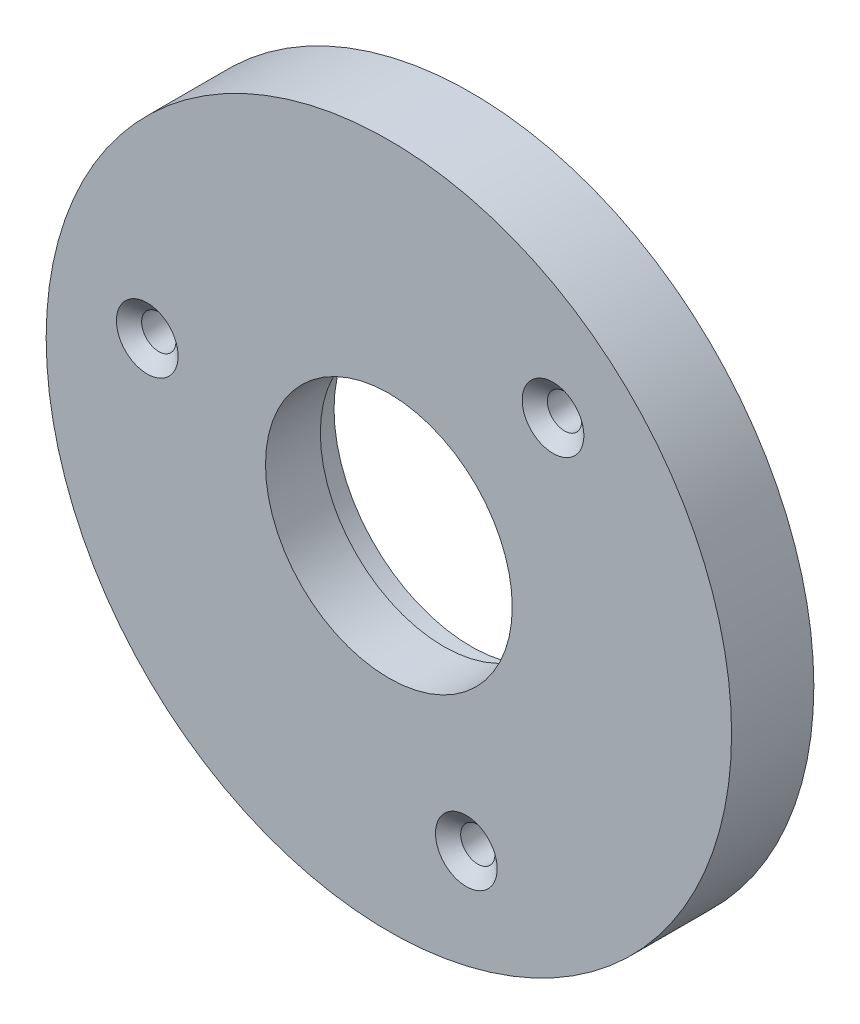
ISO-10303-21;
HEADER;
FILE_DESCRIPTION(('STEP AP214'),'2;1');
FILE_NAME('part.step','',(''),(''),'','','');
FILE_SCHEMA(('AUTOMOTIVE_DESIGN { 1 0 10303 214 1 1 1 1 }'));
ENDSEC;
DATA;
#1=APPLICATION_CONTEXT('core data for automotive mechanical design processes');
#2=APPLICATION_PROTOCOL_DEFINITION('international standard','automotive_design',2000,#1);
#3=PRODUCT_CONTEXT('',#1,'mechanical');
#4=PRODUCT('Part','Part','',(#3));
#5=PRODUCT_RELATED_PRODUCT_CATEGORY('part','',(#4));
#6=PRODUCT_DEFINITION_FORMATION('','',#4);
#7=PRODUCT_DEFINITION_CONTEXT('part definition',#1,'design');
#8=PRODUCT_DEFINITION('design','',#6,#7);
#9=PRODUCT_DEFINITION_SHAPE('','',#8);
#10=(LENGTH_UNIT() NAMED_UNIT(*) SI_UNIT(.MILLI.,.METRE.));
#11=(NAMED_UNIT(*) PLANE_ANGLE_UNIT() SI_UNIT($,.RADIAN.));
#12=(NAMED_UNIT(*) SI_UNIT($,.STERADIAN.) SOLID_ANGLE_UNIT());
#13=UNCERTAINTY_MEASURE_WITH_UNIT(LENGTH_MEASURE(1.E-05),#10,'distance_accuracy_value','');
#14=(GEOMETRIC_REPRESENTATION_CONTEXT(3) GLOBAL_UNCERTAINTY_ASSIGNED_CONTEXT((#13)) GLOBAL_UNIT_ASSIGNED_CONTEXT((#10,
#11,#12)) REPRESENTATION_CONTEXT('',''));
#15=CARTESIAN_POINT('',(0.,0.,0.));
#16=DIRECTION('',(0.,0.,1.));
#17=DIRECTION('',(1.,0.,0.));
#18=AXIS2_PLACEMENT_3D('',#15,#16,#17);
#19=CARTESIAN_POINT('',(0.,0.,0.));
#20=DIRECTION('',(0.,0.,1.));
#21=DIRECTION('',(1.,0.,0.));
#22=AXIS2_PLACEMENT_3D('',#19,#20,#21);
#23=CYLINDRICAL_SURFACE('',#22,5.715);
#24=CARTESIAN_POINT('',(0.,0.,3.81));
#25=DIRECTION('',(0.,0.,1.));
#26=DIRECTION('',(1.,0.,0.));
#27=AXIS2_PLACEMENT_3D('',#24,#25,#26);
#28=CIRCLE('',#27,5.715);
#29=CARTESIAN_POINT('',(5.715,0.,3.81));
#30=VERTEX_POINT('',#29);
#31=EDGE_CURVE('E53',#30,#30,#28,.T.);
#32=CARTESIAN_POINT('',(0.,0.,1.27));
#33=DIRECTION('',(0.,0.,-1.));
#34=DIRECTION('',(-1.,0.,0.));
#35=AXIS2_PLACEMENT_3D('',#32,#33,#34);
#36=CIRCLE('',#35,5.715);
#37=CARTESIAN_POINT('',(5.715,0.,1.27));
#38=VERTEX_POINT('',#37);
#39=EDGE_CURVE('E44',#38,#38,#36,.F.);
#40=CARTESIAN_POINT('',(5.715,0.,3.81));
#41=CARTESIAN_POINT('',(5.715,0.,3.78354166666667));
#42=CARTESIAN_POINT('',(5.715,0.,3.75708333333333));
#43=CARTESIAN_POINT('',(5.715,0.,3.70416666666667));
#44=CARTESIAN_POINT('',(5.715,0.,3.67770833333333));
#45=CARTESIAN_POINT('',(5.715,0.,3.62479166666667));
#46=CARTESIAN_POINT('',(5.715,0.,3.59833333333333));
#47=CARTESIAN_POINT('',(5.715,0.,3.54541666666667));
#48=CARTESIAN_POINT('',(5.715,0.,3.51895833333333));
#49=CARTESIAN_POINT('',(5.715,0.,3.46604166666667));
#50=CARTESIAN_POINT('',(5.715,0.,3.43958333333333));
#51=CARTESIAN_POINT('',(5.715,0.,3.38666666666667));
#52=CARTESIAN_POINT('',(5.715,0.,3.36020833333333));
#53=CARTESIAN_POINT('',(5.715,0.,3.30729166666667));
#54=CARTESIAN_POINT('',(5.715,0.,3.28083333333333));
#55=CARTESIAN_POINT('',(5.715,0.,3.22791666666667));
#56=CARTESIAN_POINT('',(5.715,0.,3.20145833333333));
#57=CARTESIAN_POINT('',(5.715,0.,3.14854166666667));
#58=CARTESIAN_POINT('',(5.715,0.,3.12208333333333));
#59=CARTESIAN_POINT('',(5.715,0.,3.06916666666667));
#60=CARTESIAN_POINT('',(5.715,0.,3.04270833333333));
#61=CARTESIAN_POINT('',(5.715,0.,2.98979166666667));
#62=CARTESIAN_POINT('',(5.715,0.,2.96333333333333));
#63=CARTESIAN_POINT('',(5.715,0.,2.91041666666667));
#64=CARTESIAN_POINT('',(5.715,0.,2.88395833333333));
#65=CARTESIAN_POINT('',(5.715,0.,2.83104166666667));
#66=CARTESIAN_POINT('',(5.715,0.,2.80458333333333));
#67=CARTESIAN_POINT('',(5.715,0.,2.75166666666667));
#68=CARTESIAN_POINT('',(5.715,0.,2.72520833333333));
#69=CARTESIAN_POINT('',(5.715,0.,2.67229166666667));
#70=CARTESIAN_POINT('',(5.715,0.,2.64583333333333));
#71=CARTESIAN_POINT('',(5.715,0.,2.59291666666667));
#72=CARTESIAN_POINT('',(5.715,0.,2.56645833333333));
#73=CARTESIAN_POINT('',(5.715,0.,2.51354166666667));
#74=CARTESIAN_POINT('',(5.715,0.,2.48708333333333));
#75=CARTESIAN_POINT('',(5.715,0.,2.43416666666667));
#76=CARTESIAN_POINT('',(5.715,0.,2.40770833333333));
#77=CARTESIAN_POINT('',(5.715,0.,2.35479166666667));
#78=CARTESIAN_POINT('',(5.715,0.,2.32833333333333));
#79=CARTESIAN_POINT('',(5.715,0.,2.27541666666667));
#80=CARTESIAN_POINT('',(5.715,0.,2.24895833333333));
#81=CARTESIAN_POINT('',(5.715,0.,2.19604166666667));
#82=CARTESIAN_POINT('',(5.715,0.,2.16958333333333));
#83=CARTESIAN_POINT('',(5.715,0.,2.11666666666667));
#84=CARTESIAN_POINT('',(5.715,0.,2.09020833333333));
#85=CARTESIAN_POINT('',(5.715,0.,2.03729166666667));
#86=CARTESIAN_POINT('',(5.715,0.,2.01083333333333));
#87=CARTESIAN_POINT('',(5.715,0.,1.95791666666667));
#88=CARTESIAN_POINT('',(5.715,0.,1.93145833333333));
#89=CARTESIAN_POINT('',(5.715,0.,1.87854166666667));
#90=CARTESIAN_POINT('',(5.715,0.,1.85208333333333));
#91=CARTESIAN_POINT('',(5.715,0.,1.79916666666667));
#92=CARTESIAN_POINT('',(5.715,0.,1.77270833333333));
#93=CARTESIAN_POINT('',(5.715,0.,1.71979166666667));
#94=CARTESIAN_POINT('',(5.715,0.,1.69333333333333));
#95=CARTESIAN_POINT('',(5.715,0.,1.64041666666667));
#96=CARTESIAN_POINT('',(5.715,0.,1.61395833333333));
#97=CARTESIAN_POINT('',(5.715,0.,1.56104166666667));
#98=CARTESIAN_POINT('',(5.715,0.,1.53458333333333));
#99=CARTESIAN_POINT('',(5.715,0.,1.48166666666667));
#100=CARTESIAN_POINT('',(5.715,0.,1.45520833333333));
#101=CARTESIAN_POINT('',(5.715,0.,1.40229166666667));
#102=CARTESIAN_POINT('',(5.715,0.,1.37583333333333));
#103=CARTESIAN_POINT('',(5.715,0.,1.32291666666667));
#104=CARTESIAN_POINT('',(5.715,0.,1.29645833333333));
#105=CARTESIAN_POINT('',(5.715,0.,1.27));
#106=B_SPLINE_CURVE_WITH_KNOTS('',3,(#40,#41,#42,#43,#44,#45,#46,#47,#48,#49,#50,#51,#52,#53,
#54,#55,#56,#57,#58,#59,#60,#61,#62,#63,#64,#65,#66,#67,#68,#69,#70,#71,#72,#73,#74,#75,#76,#77,
#78,#79,#80,#81,#82,#83,#84,#85,#86,#87,#88,#89,#90,#91,#92,#93,#94,#95,#96,#97,#98,#99,#100,
#101,#102,#103,#104,#105),.UNSPECIFIED.,.F.,.F.,(4,2,2,2,2,2,2,2,2,2,2,2,2,2,2,2,2,2,2,2,2,2,2,
2,2,2,2,2,2,2,2,2,4),(0.,0.079375,0.15875,0.238125,0.3175,0.396875,0.47625,0.555625,0.635,
0.714375,0.79375,0.873125,0.9525,1.031875,1.11125,1.190625,1.27,1.349375,1.42875,1.508125,
1.5875,1.666875,1.74625,1.825625,1.905,1.984375,2.06375,2.143125,2.2225,2.301875,2.38125,
2.460625,2.54),.UNSPECIFIED.);
#107=EDGE_CURVE('BSEAM40',#30,#38,#106,.T.);
#108=ORIENTED_EDGE('',*,*,#31,.T.);
#109=ORIENTED_EDGE('',*,*,#39,.F.);
#110=ORIENTED_EDGE('',*,*,#107,.T.);
#111=ORIENTED_EDGE('',*,*,#107,.F.);
#112=EDGE_LOOP('',(#108,#110,#109,#111));
#113=FACE_BOUND('',#112,.T.);
#114=ADVANCED_FACE('F40',(#113),#23,.F.);
#115=CARTESIAN_POINT('',(0.,0.,3.81));
#116=DIRECTION('',(0.,0.,-1.));
#117=DIRECTION('',(-1.,0.,0.));
#118=AXIS2_PLACEMENT_3D('',#115,#116,#117);
#119=CYLINDRICAL_SURFACE('',#118,15.875);
#120=CARTESIAN_POINT('',(0.,0.,3.81));
#121=DIRECTION('',(0.,0.,1.));
#122=DIRECTION('',(1.,0.,0.));
#123=AXIS2_PLACEMENT_3D('',#120,#121,#122);
#124=CIRCLE('',#123,15.875);
#125=CARTESIAN_POINT('',(-15.875,0.,3.81));
#126=VERTEX_POINT('',#125);
#127=EDGE_CURVE('E10',#126,#126,#124,.T.);
#128=CARTESIAN_POINT('',(0.,0.,0.));
#129=DIRECTION('',(0.,0.,1.));
#130=DIRECTION('',(1.,0.,0.));
#131=AXIS2_PLACEMENT_3D('',#128,#129,#130);
#132=CIRCLE('',#131,15.875);
#133=CARTESIAN_POINT('',(-15.875,0.,0.));
#134=VERTEX_POINT('',#133);
#135=EDGE_CURVE('E48',#134,#134,#132,.T.);
#136=CARTESIAN_POINT('',(-15.875,0.,3.81));
#137=CARTESIAN_POINT('',(-15.875,0.,3.7703125));
#138=CARTESIAN_POINT('',(-15.875,0.,3.730625));
#139=CARTESIAN_POINT('',(-15.875,0.,3.65125));
#140=CARTESIAN_POINT('',(-15.875,0.,3.6115625));
#141=CARTESIAN_POINT('',(-15.875,0.,3.5321875));
#142=CARTESIAN_POINT('',(-15.875,0.,3.4925));
#143=CARTESIAN_POINT('',(-15.875,0.,3.413125));
#144=CARTESIAN_POINT('',(-15.875,0.,3.3734375));
#145=CARTESIAN_POINT('',(-15.875,0.,3.2940625));
#146=CARTESIAN_POINT('',(-15.875,0.,3.254375));
#147=CARTESIAN_POINT('',(-15.875,0.,3.175));
#148=CARTESIAN_POINT('',(-15.875,0.,3.1353125));
#149=CARTESIAN_POINT('',(-15.875,0.,3.0559375));
#150=CARTESIAN_POINT('',(-15.875,0.,3.01625));
#151=CARTESIAN_POINT('',(-15.875,0.,2.936875));
#152=CARTESIAN_POINT('',(-15.875,0.,2.8971875));
#153=CARTESIAN_POINT('',(-15.875,0.,2.8178125));
#154=CARTESIAN_POINT('',(-15.875,0.,2.778125));
#155=CARTESIAN_POINT('',(-15.875,0.,2.69875));
#156=CARTESIAN_POINT('',(-15.875,0.,2.6590625));
#157=CARTESIAN_POINT('',(-15.875,0.,2.5796875));
#158=CARTESIAN_POINT('',(-15.875,0.,2.54));
#159=CARTESIAN_POINT('',(-15.875,0.,2.460625));
#160=CARTESIAN_POINT('',(-15.875,0.,2.4209375));
#161=CARTESIAN_POINT('',(-15.875,0.,2.3415625));
#162=CARTESIAN_POINT('',(-15.875,0.,2.301875));
#163=CARTESIAN_POINT('',(-15.875,0.,2.2225));
#164=CARTESIAN_POINT('',(-15.875,0.,2.1828125));
#165=CARTESIAN_POINT('',(-15.875,0.,2.1034375));
#166=CARTESIAN_POINT('',(-15.875,0.,2.06375));
#167=CARTESIAN_POINT('',(-15.875,0.,1.984375));
#168=CARTESIAN_POINT('',(-15.875,0.,1.9446875));
#169=CARTESIAN_POINT('',(-15.875,0.,1.8653125));
#170=CARTESIAN_POINT('',(-15.875,0.,1.825625));
#171=CARTESIAN_POINT('',(-15.875,0.,1.74625));
#172=CARTESIAN_POINT('',(-15.875,0.,1.7065625));
#173=CARTESIAN_POINT('',(-15.875,0.,1.6271875));
#174=CARTESIAN_POINT('',(-15.875,0.,1.5875));
#175=CARTESIAN_POINT('',(-15.875,0.,1.508125));
#176=CARTESIAN_POINT('',(-15.875,0.,1.4684375));
#177=CARTESIAN_POINT('',(-15.875,0.,1.3890625));
#178=CARTESIAN_POINT('',(-15.875,0.,1.349375));
#179=CARTESIAN_POINT('',(-15.875,0.,1.27));
#180=CARTESIAN_POINT('',(-15.875,0.,1.2303125));
#181=CARTESIAN_POINT('',(-15.875,0.,1.1509375));
#182=CARTESIAN_POINT('',(-15.875,0.,1.11125));
#183=CARTESIAN_POINT('',(-15.875,0.,1.031875));
#184=CARTESIAN_POINT('',(-15.875,0.,0.9921875));
#185=CARTESIAN_POINT('',(-15.875,0.,0.9128125));
#186=CARTESIAN_POINT('',(-15.875,0.,0.873125));
#187=CARTESIAN_POINT('',(-15.875,0.,0.79375));
#188=CARTESIAN_POINT('',(-15.875,0.,0.7540625));
#189=CARTESIAN_POINT('',(-15.875,0.,0.6746875));
#190=CARTESIAN_POINT('',(-15.875,0.,0.635));
#191=CARTESIAN_POINT('',(-15.875,0.,0.555625));
#192=CARTESIAN_POINT('',(-15.875,0.,0.5159375));
#193=CARTESIAN_POINT('',(-15.875,0.,0.4365625));
#194=CARTESIAN_POINT('',(-15.875,0.,0.396875));
#195=CARTESIAN_POINT('',(-15.875,0.,0.3175));
#196=CARTESIAN_POINT('',(-15.875,0.,0.2778125));
#197=CARTESIAN_POINT('',(-15.875,0.,0.1984375));
#198=CARTESIAN_POINT('',(-15.875,0.,0.15875));
#199=CARTESIAN_POINT('',(-15.875,0.,0.0793749999999999));
#200=CARTESIAN_POINT('',(-15.875,0.,0.0396874999999999));
#201=CARTESIAN_POINT('',(-15.875,0.,0.));
#202=B_SPLINE_CURVE_WITH_KNOTS('',3,(#136,#137,#138,#139,#140,#141,#142,#143,#144,#145,#146,
#147,#148,#149,#150,#151,#152,#153,#154,#155,#156,#157,#158,#159,#160,#161,#162,#163,#164,#165,
#166,#167,#168,#169,#170,#171,#172,#173,#174,#175,#176,#177,#178,#179,#180,#181,#182,#183,#184,
#185,#186,#187,#188,#189,#190,#191,#192,#193,#194,#195,#196,#197,#198,#199,#200,#201),
.UNSPECIFIED.,.F.,.F.,(4,2,2,2,2,2,2,2,2,2,2,2,2,2,2,2,2,2,2,2,2,2,2,2,2,2,2,2,2,2,2,2,4),(0.,
0.1190625,0.238125,0.3571875,0.47625,0.5953125,0.714375,0.8334375,0.9525,1.0715625,1.190625,
1.3096875,1.42875,1.5478125,1.666875,1.7859375,1.905,2.0240625,2.143125,2.2621875,2.38125,
2.5003125,2.619375,2.7384375,2.8575,2.9765625,3.095625,3.2146875,3.33375,3.4528125,3.571875,
3.6909375,3.81),.UNSPECIFIED.);
#203=EDGE_CURVE('BSEAM42',#126,#134,#202,.T.);
#204=ORIENTED_EDGE('',*,*,#127,.F.);
#205=ORIENTED_EDGE('',*,*,#135,.T.);
#206=ORIENTED_EDGE('',*,*,#203,.T.);
#207=ORIENTED_EDGE('',*,*,#203,.F.);
#208=EDGE_LOOP('',(#204,#206,#205,#207));
#209=FACE_BOUND('',#208,.T.);
#210=ADVANCED_FACE('F42',(#209),#119,.T.);
#211=CARTESIAN_POINT('',(0.,0.,3.81));
#212=DIRECTION('',(0.,0.,1.));
#213=DIRECTION('',(1.,0.,0.));
#214=AXIS2_PLACEMENT_3D('',#211,#212,#213);
#215=PLANE('',#214);
#216=CARTESIAN_POINT('',(-11.192179959455,2.31948437269439,3.81));
#217=DIRECTION('',(0.,0.,1.));
#218=DIRECTION('',(1.,0.,0.));
#219=AXIS2_PLACEMENT_3D('',#216,#217,#218);
#220=CIRCLE('',#219,1.42875);
#221=CARTESIAN_POINT('',(-9.76342995945502,2.31948437269439,3.81));
#222=VERTEX_POINT('',#221);
#223=EDGE_CURVE('E87',#222,#222,#220,.T.);
#224=ORIENTED_EDGE('',*,*,#223,.F.);
#225=EDGE_LOOP('',(#224));
#226=FACE_BOUND('',#225,.T.);
#227=CARTESIAN_POINT('',(3.58735758929321,-10.8524543549623,3.81));
#228=DIRECTION('',(0.,0.,1.));
#229=DIRECTION('',(1.,0.,0.));
#230=AXIS2_PLACEMENT_3D('',#227,#228,#229);
#231=CIRCLE('',#230,1.42875);
#232=CARTESIAN_POINT('',(5.01610758929321,-10.8524543549623,3.81));
#233=VERTEX_POINT('',#232);
#234=EDGE_CURVE('E78',#233,#233,#231,.T.);
#235=ORIENTED_EDGE('',*,*,#234,.F.);
#236=EDGE_LOOP('',(#235));
#237=FACE_BOUND('',#236,.T.);
#238=CARTESIAN_POINT('',(7.60482237016178,8.53296998226801,3.81));
#239=DIRECTION('',(0.,0.,1.));
#240=DIRECTION('',(1.,0.,0.));
#241=AXIS2_PLACEMENT_3D('',#238,#239,#240);
#242=CIRCLE('',#241,1.42875);
#243=CARTESIAN_POINT('',(9.03357237016178,8.53296998226801,3.81));
#244=VERTEX_POINT('',#243);
#245=EDGE_CURVE('E69',#244,#244,#242,.T.);
#246=ORIENTED_EDGE('',*,*,#245,.F.);
#247=EDGE_LOOP('',(#246));
#248=FACE_BOUND('',#247,.T.);
#249=ORIENTED_EDGE('',*,*,#31,.F.);
#250=EDGE_LOOP('',(#249));
#251=FACE_BOUND('',#250,.T.);
#252=ORIENTED_EDGE('',*,*,#127,.T.);
#253=EDGE_LOOP('',(#252));
#254=FACE_BOUND('',#253,.T.);
#255=ADVANCED_FACE('F93',(#226,#237,#248,#251,#254),#215,.T.);
#256=CARTESIAN_POINT('',(0.,0.,0.));
#257=DIRECTION('',(0.,0.,1.));
#258=DIRECTION('',(1.,0.,0.));
#259=AXIS2_PLACEMENT_3D('',#256,#257,#258);
#260=PLANE('',#259);
#261=CARTESIAN_POINT('',(-11.192179959455,2.31948437269439,0.));
#262=DIRECTION('',(0.,0.,1.));
#263=DIRECTION('',(1.,0.,0.));
#264=AXIS2_PLACEMENT_3D('',#261,#262,#263);
#265=CIRCLE('',#264,0.793749999999999);
#266=CARTESIAN_POINT('',(-10.398429959455,2.31948437269439,0.));
#267=VERTEX_POINT('',#266);
#268=EDGE_CURVE('E81',#267,#267,#265,.T.);
#269=ORIENTED_EDGE('',*,*,#268,.T.);
#270=EDGE_LOOP('',(#269));
#271=FACE_BOUND('',#270,.T.);
#272=CARTESIAN_POINT('',(3.58735758929321,-10.8524543549623,0.));
#273=DIRECTION('',(0.,0.,1.));
#274=DIRECTION('',(1.,0.,0.));
#275=AXIS2_PLACEMENT_3D('',#272,#273,#274);
#276=CIRCLE('',#275,0.793749999999999);
#277=CARTESIAN_POINT('',(4.38110758929321,-10.8524543549623,0.));
#278=VERTEX_POINT('',#277);
#279=EDGE_CURVE('E72',#278,#278,#276,.T.);
#280=ORIENTED_EDGE('',*,*,#279,.T.);
#281=EDGE_LOOP('',(#280));
#282=FACE_BOUND('',#281,.T.);
#283=CARTESIAN_POINT('',(7.60482237016178,8.53296998226801,0.));
#284=DIRECTION('',(0.,0.,1.));
#285=DIRECTION('',(1.,0.,0.));
#286=AXIS2_PLACEMENT_3D('',#283,#284,#285);
#287=CIRCLE('',#286,0.793749999999999);
#288=CARTESIAN_POINT('',(8.39857237016178,8.53296998226801,0.));
#289=VERTEX_POINT('',#288);
#290=EDGE_CURVE('E61',#289,#289,#287,.T.);
#291=ORIENTED_EDGE('',*,*,#290,.T.);
#292=EDGE_LOOP('',(#291));
#293=FACE_BOUND('',#292,.T.);
#294=CARTESIAN_POINT('',(0.,0.,0.));
#295=DIRECTION('',(0.,0.,-1.));
#296=DIRECTION('',(-1.,0.,0.));
#297=AXIS2_PLACEMENT_3D('',#294,#295,#296);
#298=CIRCLE('',#297,6.35);
#299=CARTESIAN_POINT('',(-6.35,0.,0.));
#300=VERTEX_POINT('',#299);
#301=EDGE_CURVE('E57',#300,#300,#298,.T.);
#302=ORIENTED_EDGE('',*,*,#301,.F.);
#303=EDGE_LOOP('',(#302));
#304=FACE_BOUND('',#303,.T.);
#305=ORIENTED_EDGE('',*,*,#135,.F.);
#306=EDGE_LOOP('',(#305));
#307=FACE_BOUND('',#306,.T.);
#308=ADVANCED_FACE('F96',(#271,#282,#293,#304,#307),#260,.F.);
#309=CARTESIAN_POINT('',(0.,0.,1.27));
#310=DIRECTION('',(0.,0.,-1.));
#311=DIRECTION('',(-1.,0.,0.));
#312=AXIS2_PLACEMENT_3D('',#309,#310,#311);
#313=PLANE('',#312);
#314=CARTESIAN_POINT('',(0.,0.,1.27));
#315=DIRECTION('',(0.,0.,-1.));
#316=DIRECTION('',(-1.,0.,0.));
#317=AXIS2_PLACEMENT_3D('',#314,#315,#316);
#318=CIRCLE('',#317,6.35);
#319=CARTESIAN_POINT('',(-6.35,0.,1.27));
#320=VERTEX_POINT('',#319);
#321=EDGE_CURVE('E60',#320,#320,#318,.T.);
#322=ORIENTED_EDGE('',*,*,#321,.T.);
#323=EDGE_LOOP('',(#322));
#324=FACE_BOUND('',#323,.T.);
#325=ORIENTED_EDGE('',*,*,#39,.T.);
#326=EDGE_LOOP('',(#325));
#327=FACE_BOUND('',#326,.T.);
#328=ADVANCED_FACE('F110',(#324,#327),#313,.T.);
#329=CARTESIAN_POINT('',(0.,0.,1.27));
#330=DIRECTION('',(0.,0.,-1.));
#331=DIRECTION('',(-1.,0.,0.));
#332=AXIS2_PLACEMENT_3D('',#329,#330,#331);
#333=CYLINDRICAL_SURFACE('',#332,6.35);
#334=ORIENTED_EDGE('',*,*,#321,.F.);
#335=EDGE_LOOP('',(#334));
#336=FACE_BOUND('',#335,.T.);
#337=ORIENTED_EDGE('',*,*,#301,.T.);
#338=EDGE_LOOP('',(#337));
#339=FACE_BOUND('',#338,.T.);
#340=ADVANCED_FACE('F112',(#336,#339),#333,.F.);
#341=CARTESIAN_POINT('',(7.60482237016178,8.53296998226801,3.81));
#342=DIRECTION('',(0.,0.,1.));
#343=DIRECTION('',(1.,0.,0.));
#344=AXIS2_PLACEMENT_3D('',#341,#342,#343);
#345=CYLINDRICAL_SURFACE('',#344,0.793749999999999);
#346=ORIENTED_EDGE('',*,*,#290,.F.);
#347=EDGE_LOOP('',(#346));
#348=FACE_BOUND('',#347,.T.);
#349=CARTESIAN_POINT('',(7.60482237016178,8.53296998226801,3.27717173420243));
#350=DIRECTION('',(0.,0.,1.));
#351=DIRECTION('',(1.,0.,0.));
#352=AXIS2_PLACEMENT_3D('',#349,#350,#351);
#353=CIRCLE('',#352,0.793749999999999);
#354=CARTESIAN_POINT('',(8.39857237016178,8.53296998226801,3.27717173420243));
#355=VERTEX_POINT('',#354);
#356=EDGE_CURVE('E66',#355,#355,#353,.T.);
#357=ORIENTED_EDGE('',*,*,#356,.T.);
#358=EDGE_LOOP('',(#357));
#359=FACE_BOUND('',#358,.T.);
#360=ADVANCED_FACE('F119',(#348,#359),#345,.F.);
#361=CARTESIAN_POINT('',(7.60482237016178,8.53296998226801,3.81));
#362=DIRECTION('',(0.,0.,1.));
#363=DIRECTION('',(1.,0.,0.));
#364=AXIS2_PLACEMENT_3D('',#361,#362,#363);
#365=CONICAL_SURFACE('',#364,1.42875,0.872664625997165);
#366=ORIENTED_EDGE('',*,*,#356,.F.);
#367=EDGE_LOOP('',(#366));
#368=FACE_BOUND('',#367,.T.);
#369=ORIENTED_EDGE('',*,*,#245,.T.);
#370=EDGE_LOOP('',(#369));
#371=FACE_BOUND('',#370,.T.);
#372=ADVANCED_FACE('F126',(#368,#371),#365,.F.);
#373=CARTESIAN_POINT('',(3.58735758929321,-10.8524543549623,3.81));
#374=DIRECTION('',(0.,0.,1.));
#375=DIRECTION('',(1.,0.,0.));
#376=AXIS2_PLACEMENT_3D('',#373,#374,#375);
#377=CYLINDRICAL_SURFACE('',#376,0.793749999999999);
#378=ORIENTED_EDGE('',*,*,#279,.F.);
#379=EDGE_LOOP('',(#378));
#380=FACE_BOUND('',#379,.T.);
#381=CARTESIAN_POINT('',(3.58735758929321,-10.8524543549623,3.27717173420243));
#382=DIRECTION('',(0.,0.,1.));
#383=DIRECTION('',(1.,0.,0.));
#384=AXIS2_PLACEMENT_3D('',#381,#382,#383);
#385=CIRCLE('',#384,0.793749999999999);
#386=CARTESIAN_POINT('',(4.38110758929321,-10.8524543549623,3.27717173420243));
#387=VERTEX_POINT('',#386);
#388=EDGE_CURVE('E75',#387,#387,#385,.T.);
#389=ORIENTED_EDGE('',*,*,#388,.T.);
#390=EDGE_LOOP('',(#389));
#391=FACE_BOUND('',#390,.T.);
#392=ADVANCED_FACE('F130',(#380,#391),#377,.F.);
#393=CARTESIAN_POINT('',(3.58735758929321,-10.8524543549623,3.81));
#394=DIRECTION('',(0.,0.,1.));
#395=DIRECTION('',(1.,0.,0.));
#396=AXIS2_PLACEMENT_3D('',#393,#394,#395);
#397=CONICAL_SURFACE('',#396,1.42875,0.872664625997165);
#398=ORIENTED_EDGE('',*,*,#388,.F.);
#399=EDGE_LOOP('',(#398));
#400=FACE_BOUND('',#399,.T.);
#401=ORIENTED_EDGE('',*,*,#234,.T.);
#402=EDGE_LOOP('',(#401));
#403=FACE_BOUND('',#402,.T.);
#404=ADVANCED_FACE('F134',(#400,#403),#397,.F.);
#405=CARTESIAN_POINT('',(-11.192179959455,2.31948437269439,3.81));
#406=DIRECTION('',(0.,0.,1.));
#407=DIRECTION('',(1.,0.,0.));
#408=AXIS2_PLACEMENT_3D('',#405,#406,#407);
#409=CYLINDRICAL_SURFACE('',#408,0.793749999999999);
#410=ORIENTED_EDGE('',*,*,#268,.F.);
#411=EDGE_LOOP('',(#410));
#412=FACE_BOUND('',#411,.T.);
#413=CARTESIAN_POINT('',(-11.192179959455,2.31948437269439,3.27717173420243));
#414=DIRECTION('',(0.,0.,1.));
#415=DIRECTION('',(1.,0.,0.));
#416=AXIS2_PLACEMENT_3D('',#413,#414,#415);
#417=CIRCLE('',#416,0.793749999999999);
#418=CARTESIAN_POINT('',(-10.398429959455,2.31948437269439,3.27717173420243));
#419=VERTEX_POINT('',#418);
#420=EDGE_CURVE('E84',#419,#419,#417,.T.);
#421=ORIENTED_EDGE('',*,*,#420,.T.);
#422=EDGE_LOOP('',(#421));
#423=FACE_BOUND('',#422,.T.);
#424=ADVANCED_FACE('F138',(#412,#423),#409,.F.);
#425=CARTESIAN_POINT('',(-11.192179959455,2.31948437269439,3.81));
#426=DIRECTION('',(0.,0.,1.));
#427=DIRECTION('',(1.,0.,0.));
#428=AXIS2_PLACEMENT_3D('',#425,#426,#427);
#429=CONICAL_SURFACE('',#428,1.42875,0.872664625997165);
#430=ORIENTED_EDGE('',*,*,#420,.F.);
#431=EDGE_LOOP('',(#430));
#432=FACE_BOUND('',#431,.T.);
#433=ORIENTED_EDGE('',*,*,#223,.T.);
#434=EDGE_LOOP('',(#433));
#435=FACE_BOUND('',#434,.T.);
#436=ADVANCED_FACE('F91',(#432,#435),#429,.F.);
#437=CLOSED_SHELL('',(#114,#210,#255,#308,#328,#340,#360,#372,#392,#404,#424,#436));
#438=MANIFOLD_SOLID_BREP('B2',#437);
#439=ADVANCED_BREP_SHAPE_REPRESENTATION('',(#18,#438),#14);
#440=SHAPE_DEFINITION_REPRESENTATION(#9,#439);
ENDSEC;
END-ISO-10303-21;
